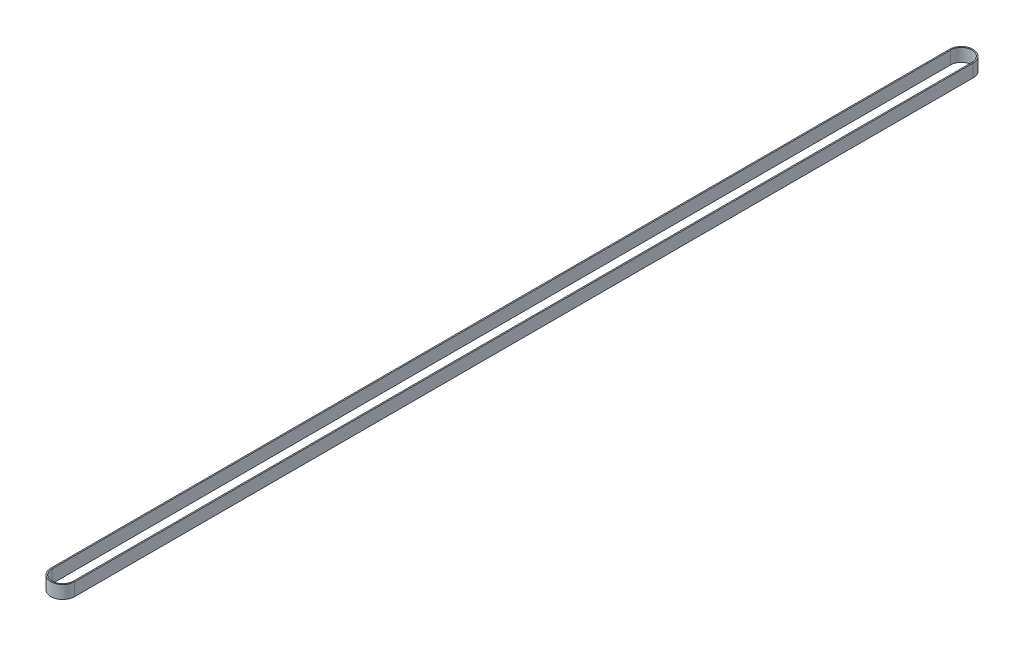
ISO-10303-21;
HEADER;
FILE_DESCRIPTION(('STEP AP214'),'2;1');
FILE_NAME('part.step','',(''),(''),'','','');
FILE_SCHEMA(('AUTOMOTIVE_DESIGN { 1 0 10303 214 1 1 1 1 }'));
ENDSEC;
DATA;
#1=APPLICATION_CONTEXT('core data for automotive mechanical design processes');
#2=APPLICATION_PROTOCOL_DEFINITION('international standard','automotive_design',2000,#1);
#3=PRODUCT_CONTEXT('',#1,'mechanical');
#4=PRODUCT('Part','Part','',(#3));
#5=PRODUCT_RELATED_PRODUCT_CATEGORY('part','',(#4));
#6=PRODUCT_DEFINITION_FORMATION('','',#4);
#7=PRODUCT_DEFINITION_CONTEXT('part definition',#1,'design');
#8=PRODUCT_DEFINITION('design','',#6,#7);
#9=PRODUCT_DEFINITION_SHAPE('','',#8);
#10=(LENGTH_UNIT() NAMED_UNIT(*) SI_UNIT(.MILLI.,.METRE.));
#11=(NAMED_UNIT(*) PLANE_ANGLE_UNIT() SI_UNIT($,.RADIAN.));
#12=(NAMED_UNIT(*) SI_UNIT($,.STERADIAN.) SOLID_ANGLE_UNIT());
#13=UNCERTAINTY_MEASURE_WITH_UNIT(LENGTH_MEASURE(1.E-05),#10,'distance_accuracy_value','');
#14=(GEOMETRIC_REPRESENTATION_CONTEXT(3) GLOBAL_UNCERTAINTY_ASSIGNED_CONTEXT((#13)) GLOBAL_UNIT_ASSIGNED_CONTEXT((#10,
#11,#12)) REPRESENTATION_CONTEXT('',''));
#15=CARTESIAN_POINT('',(0.,0.,0.));
#16=DIRECTION('',(0.,0.,1.));
#17=DIRECTION('',(1.,0.,0.));
#18=AXIS2_PLACEMENT_3D('',#15,#16,#17);
#19=CARTESIAN_POINT('',(-3.45527341487804E-12,11.,-400.));
#20=DIRECTION('',(0.,1.,0.));
#21=DIRECTION('',(0.,0.,1.));
#22=AXIS2_PLACEMENT_3D('',#19,#20,#21);
#23=PLANE('',#22);
#24=CARTESIAN_POINT('',(-3.45527341487804E-12,11.,-400.));
#25=DIRECTION('',(0.,1.,0.));
#26=DIRECTION('',(0.,0.,1.));
#27=AXIS2_PLACEMENT_3D('',#24,#25,#26);
#28=CIRCLE('',#27,10.05);
#29=CARTESIAN_POINT('',(10.0499999999966,11.,-400.));
#30=VERTEX_POINT('',#29);
#31=CARTESIAN_POINT('',(-10.0500000000034,11.,-400.));
#32=VERTEX_POINT('',#31);
#33=EDGE_CURVE('E153',#30,#32,#28,.T.);
#34=ORIENTED_EDGE('',*,*,#33,.T.);
#35=DIRECTION('',(0.,0.,1.));
#36=VECTOR('',#35,1.);
#37=CARTESIAN_POINT('',(-10.0500000000034,11.,-400.));
#38=LINE('',#37,#36);
#39=CARTESIAN_POINT('',(-10.0500000000034,11.,362.5));
#40=VERTEX_POINT('',#39);
#41=EDGE_CURVE('E157',#32,#40,#38,.T.);
#42=ORIENTED_EDGE('',*,*,#41,.T.);
#43=CARTESIAN_POINT('',(-3.38444550163075E-12,11.,362.5));
#44=DIRECTION('',(0.,1.,0.));
#45=DIRECTION('',(0.,0.,1.));
#46=AXIS2_PLACEMENT_3D('',#43,#44,#45);
#47=CIRCLE('',#46,10.05);
#48=CARTESIAN_POINT('',(10.0499999999966,11.,362.5));
#49=VERTEX_POINT('',#48);
#50=EDGE_CURVE('E161',#40,#49,#47,.T.);
#51=ORIENTED_EDGE('',*,*,#50,.T.);
#52=DIRECTION('',(0.,0.,-1.));
#53=VECTOR('',#52,1.);
#54=CARTESIAN_POINT('',(10.0499999999966,11.,362.5));
#55=LINE('',#54,#53);
#56=EDGE_CURVE('E164',#49,#30,#55,.T.);
#57=ORIENTED_EDGE('',*,*,#56,.T.);
#58=EDGE_LOOP('',(#34,#42,#51,#57));
#59=FACE_BOUND('',#58,.T.);
#60=DIRECTION('',(0.,0.,1.));
#61=VECTOR('',#60,1.);
#62=CARTESIAN_POINT('',(-9.05000000000344,11.,-400.));
#63=LINE('',#62,#61);
#64=CARTESIAN_POINT('',(-9.05000000000344,11.,-400.));
#65=VERTEX_POINT('',#64);
#66=CARTESIAN_POINT('',(-9.05000000000334,11.,362.5));
#67=VERTEX_POINT('',#66);
#68=EDGE_CURVE('E114',#65,#67,#63,.T.);
#69=ORIENTED_EDGE('',*,*,#68,.F.);
#70=CARTESIAN_POINT('',(-3.45527341487804E-12,11.,-400.));
#71=DIRECTION('',(0.,1.,0.));
#72=DIRECTION('',(0.,0.,1.));
#73=AXIS2_PLACEMENT_3D('',#70,#71,#72);
#74=CIRCLE('',#73,9.05000000000001);
#75=CARTESIAN_POINT('',(9.04999999999657,11.,-400.));
#76=VERTEX_POINT('',#75);
#77=EDGE_CURVE('E105',#76,#65,#74,.T.);
#78=ORIENTED_EDGE('',*,*,#77,.F.);
#79=DIRECTION('',(0.,0.,-1.));
#80=VECTOR('',#79,1.);
#81=CARTESIAN_POINT('',(9.04999999999657,11.,362.5));
#82=LINE('',#81,#80);
#83=CARTESIAN_POINT('',(9.04999999999657,11.,362.5));
#84=VERTEX_POINT('',#83);
#85=EDGE_CURVE('E131',#84,#76,#82,.T.);
#86=ORIENTED_EDGE('',*,*,#85,.F.);
#87=CARTESIAN_POINT('',(-3.38444550163075E-12,11.,362.5));
#88=DIRECTION('',(0.,1.,0.));
#89=DIRECTION('',(0.,0.,1.));
#90=AXIS2_PLACEMENT_3D('',#87,#88,#89);
#91=CIRCLE('',#90,9.04999999999996);
#92=EDGE_CURVE('E127',#67,#84,#91,.T.);
#93=ORIENTED_EDGE('',*,*,#92,.F.);
#94=EDGE_LOOP('',(#69,#78,#86,#93));
#95=FACE_BOUND('',#94,.T.);
#96=ADVANCED_FACE('F39',(#59,#95),#23,.T.);
#97=CARTESIAN_POINT('',(-3.45527341487804E-12,0.,-400.));
#98=DIRECTION('',(0.,1.,0.));
#99=DIRECTION('',(0.,0.,1.));
#100=AXIS2_PLACEMENT_3D('',#97,#98,#99);
#101=PLANE('',#100);
#102=CARTESIAN_POINT('',(-3.45527341487804E-12,0.,-400.));
#103=DIRECTION('',(0.,1.,0.));
#104=DIRECTION('',(0.,0.,1.));
#105=AXIS2_PLACEMENT_3D('',#102,#103,#104);
#106=CIRCLE('',#105,10.05);
#107=CARTESIAN_POINT('',(10.0499999999966,0.,-400.));
#108=VERTEX_POINT('',#107);
#109=CARTESIAN_POINT('',(-10.0500000000034,0.,-400.));
#110=VERTEX_POINT('',#109);
#111=EDGE_CURVE('E123',#108,#110,#106,.T.);
#112=ORIENTED_EDGE('',*,*,#111,.F.);
#113=DIRECTION('',(0.,0.,-1.));
#114=VECTOR('',#113,1.);
#115=CARTESIAN_POINT('',(10.0499999999966,0.,362.5));
#116=LINE('',#115,#114);
#117=CARTESIAN_POINT('',(10.0499999999966,0.,362.5));
#118=VERTEX_POINT('',#117);
#119=EDGE_CURVE('E158',#118,#108,#116,.T.);
#120=ORIENTED_EDGE('',*,*,#119,.F.);
#121=CARTESIAN_POINT('',(-3.38444550163075E-12,0.,362.5));
#122=DIRECTION('',(0.,1.,0.));
#123=DIRECTION('',(0.,0.,1.));
#124=AXIS2_PLACEMENT_3D('',#121,#122,#123);
#125=CIRCLE('',#124,10.05);
#126=CARTESIAN_POINT('',(-10.0500000000034,0.,362.5));
#127=VERTEX_POINT('',#126);
#128=EDGE_CURVE('E174',#127,#118,#125,.T.);
#129=ORIENTED_EDGE('',*,*,#128,.F.);
#130=DIRECTION('',(0.,0.,1.));
#131=VECTOR('',#130,1.);
#132=CARTESIAN_POINT('',(-10.0500000000034,0.,-400.));
#133=LINE('',#132,#131);
#134=EDGE_CURVE('E171',#110,#127,#133,.T.);
#135=ORIENTED_EDGE('',*,*,#134,.F.);
#136=EDGE_LOOP('',(#112,#120,#129,#135));
#137=FACE_BOUND('',#136,.T.);
#138=CARTESIAN_POINT('',(-3.45527341487804E-12,0.,-400.));
#139=DIRECTION('',(0.,1.,0.));
#140=DIRECTION('',(0.,0.,1.));
#141=AXIS2_PLACEMENT_3D('',#138,#139,#140);
#142=CIRCLE('',#141,9.05000000000001);
#143=CARTESIAN_POINT('',(9.04999999999657,0.,-400.));
#144=VERTEX_POINT('',#143);
#145=CARTESIAN_POINT('',(-9.05000000000344,0.,-400.));
#146=VERTEX_POINT('',#145);
#147=EDGE_CURVE('E63',#144,#146,#142,.T.);
#148=ORIENTED_EDGE('',*,*,#147,.T.);
#149=DIRECTION('',(0.,0.,1.));
#150=VECTOR('',#149,1.);
#151=CARTESIAN_POINT('',(-9.05000000000344,0.,-400.));
#152=LINE('',#151,#150);
#153=CARTESIAN_POINT('',(-9.05000000000334,0.,362.5));
#154=VERTEX_POINT('',#153);
#155=EDGE_CURVE('E121',#146,#154,#152,.T.);
#156=ORIENTED_EDGE('',*,*,#155,.T.);
#157=CARTESIAN_POINT('',(-3.38444550163075E-12,0.,362.5));
#158=DIRECTION('',(0.,1.,0.));
#159=DIRECTION('',(0.,0.,1.));
#160=AXIS2_PLACEMENT_3D('',#157,#158,#159);
#161=CIRCLE('',#160,9.04999999999996);
#162=CARTESIAN_POINT('',(9.04999999999657,0.,362.5));
#163=VERTEX_POINT('',#162);
#164=EDGE_CURVE('E140',#154,#163,#161,.T.);
#165=ORIENTED_EDGE('',*,*,#164,.T.);
#166=DIRECTION('',(0.,0.,-1.));
#167=VECTOR('',#166,1.);
#168=CARTESIAN_POINT('',(9.04999999999657,0.,362.5));
#169=LINE('',#168,#167);
#170=EDGE_CURVE('E115',#163,#144,#169,.T.);
#171=ORIENTED_EDGE('',*,*,#170,.T.);
#172=EDGE_LOOP('',(#148,#156,#165,#171));
#173=FACE_BOUND('',#172,.T.);
#174=ADVANCED_FACE('F197',(#137,#173),#101,.F.);
#175=CARTESIAN_POINT('',(-3.45527341487804E-12,11.,-400.));
#176=DIRECTION('',(0.,-1.,0.));
#177=DIRECTION('',(0.,0.,-1.));
#178=AXIS2_PLACEMENT_3D('',#175,#176,#177);
#179=CYLINDRICAL_SURFACE('',#178,10.05);
#180=ORIENTED_EDGE('',*,*,#111,.T.);
#181=DIRECTION('',(0.,-1.,0.));
#182=VECTOR('',#181,1.);
#183=CARTESIAN_POINT('',(-10.0500000000034,11.,-400.));
#184=LINE('',#183,#182);
#185=EDGE_CURVE('E11',#32,#110,#184,.T.);
#186=ORIENTED_EDGE('',*,*,#185,.F.);
#187=ORIENTED_EDGE('',*,*,#33,.F.);
#188=DIRECTION('',(0.,-1.,0.));
#189=VECTOR('',#188,1.);
#190=CARTESIAN_POINT('',(10.0499999999966,11.,-400.));
#191=LINE('',#190,#189);
#192=EDGE_CURVE('E167',#30,#108,#191,.T.);
#193=ORIENTED_EDGE('',*,*,#192,.T.);
#194=EDGE_LOOP('',(#180,#186,#187,#193));
#195=FACE_BOUND('',#194,.T.);
#196=ADVANCED_FACE('F41',(#195),#179,.T.);
#197=CARTESIAN_POINT('',(-10.0500000000034,11.,-400.));
#198=DIRECTION('',(1.,0.,0.));
#199=DIRECTION('',(0.,0.,-1.));
#200=AXIS2_PLACEMENT_3D('',#197,#198,#199);
#201=PLANE('',#200);
#202=ORIENTED_EDGE('',*,*,#134,.T.);
#203=DIRECTION('',(0.,-1.,0.));
#204=VECTOR('',#203,1.);
#205=CARTESIAN_POINT('',(-10.0500000000034,11.,362.5));
#206=LINE('',#205,#204);
#207=EDGE_CURVE('E48',#40,#127,#206,.T.);
#208=ORIENTED_EDGE('',*,*,#207,.F.);
#209=ORIENTED_EDGE('',*,*,#41,.F.);
#210=ORIENTED_EDGE('',*,*,#185,.T.);
#211=EDGE_LOOP('',(#202,#208,#209,#210));
#212=FACE_BOUND('',#211,.T.);
#213=ADVANCED_FACE('F207',(#212),#201,.F.);
#214=CARTESIAN_POINT('',(-3.38444550163075E-12,11.,362.5));
#215=DIRECTION('',(0.,-1.,0.));
#216=DIRECTION('',(0.,0.,-1.));
#217=AXIS2_PLACEMENT_3D('',#214,#215,#216);
#218=CYLINDRICAL_SURFACE('',#217,10.05);
#219=ORIENTED_EDGE('',*,*,#128,.T.);
#220=DIRECTION('',(0.,-1.,0.));
#221=VECTOR('',#220,1.);
#222=CARTESIAN_POINT('',(10.0499999999966,11.,362.5));
#223=LINE('',#222,#221);
#224=EDGE_CURVE('E182',#49,#118,#223,.T.);
#225=ORIENTED_EDGE('',*,*,#224,.F.);
#226=ORIENTED_EDGE('',*,*,#50,.F.);
#227=ORIENTED_EDGE('',*,*,#207,.T.);
#228=EDGE_LOOP('',(#219,#225,#226,#227));
#229=FACE_BOUND('',#228,.T.);
#230=ADVANCED_FACE('F191',(#229),#218,.T.);
#231=CARTESIAN_POINT('',(10.0499999999966,11.,362.5));
#232=DIRECTION('',(-1.,0.,0.));
#233=DIRECTION('',(0.,0.,1.));
#234=AXIS2_PLACEMENT_3D('',#231,#232,#233);
#235=PLANE('',#234);
#236=ORIENTED_EDGE('',*,*,#119,.T.);
#237=ORIENTED_EDGE('',*,*,#192,.F.);
#238=ORIENTED_EDGE('',*,*,#56,.F.);
#239=ORIENTED_EDGE('',*,*,#224,.T.);
#240=EDGE_LOOP('',(#236,#237,#238,#239));
#241=FACE_BOUND('',#240,.T.);
#242=ADVANCED_FACE('F201',(#241),#235,.F.);
#243=CARTESIAN_POINT('',(-3.45527341487804E-12,11.,-400.));
#244=DIRECTION('',(0.,-1.,0.));
#245=DIRECTION('',(0.,0.,-1.));
#246=AXIS2_PLACEMENT_3D('',#243,#244,#245);
#247=CYLINDRICAL_SURFACE('',#246,9.05000000000001);
#248=ORIENTED_EDGE('',*,*,#147,.F.);
#249=DIRECTION('',(0.,-1.,0.));
#250=VECTOR('',#249,1.);
#251=CARTESIAN_POINT('',(9.04999999999657,11.,-400.));
#252=LINE('',#251,#250);
#253=EDGE_CURVE('E109',#76,#144,#252,.T.);
#254=ORIENTED_EDGE('',*,*,#253,.F.);
#255=ORIENTED_EDGE('',*,*,#77,.T.);
#256=DIRECTION('',(0.,-1.,0.));
#257=VECTOR('',#256,1.);
#258=CARTESIAN_POINT('',(-9.05000000000344,11.,-400.));
#259=LINE('',#258,#257);
#260=EDGE_CURVE('E108',#65,#146,#259,.T.);
#261=ORIENTED_EDGE('',*,*,#260,.T.);
#262=EDGE_LOOP('',(#248,#254,#255,#261));
#263=FACE_BOUND('',#262,.T.);
#264=ADVANCED_FACE('F107',(#263),#247,.F.);
#265=CARTESIAN_POINT('',(-9.05000000000344,11.,-400.));
#266=DIRECTION('',(1.,0.,0.));
#267=DIRECTION('',(0.,0.,-1.));
#268=AXIS2_PLACEMENT_3D('',#265,#266,#267);
#269=PLANE('',#268);
#270=ORIENTED_EDGE('',*,*,#155,.F.);
#271=ORIENTED_EDGE('',*,*,#260,.F.);
#272=ORIENTED_EDGE('',*,*,#68,.T.);
#273=DIRECTION('',(0.,-1.,0.));
#274=VECTOR('',#273,1.);
#275=CARTESIAN_POINT('',(-9.05000000000334,11.,362.5));
#276=LINE('',#275,#274);
#277=EDGE_CURVE('E124',#67,#154,#276,.T.);
#278=ORIENTED_EDGE('',*,*,#277,.T.);
#279=EDGE_LOOP('',(#270,#271,#272,#278));
#280=FACE_BOUND('',#279,.T.);
#281=ADVANCED_FACE('F118',(#280),#269,.T.);
#282=CARTESIAN_POINT('',(-3.38444550163075E-12,11.,362.5));
#283=DIRECTION('',(0.,-1.,0.));
#284=DIRECTION('',(0.,0.,-1.));
#285=AXIS2_PLACEMENT_3D('',#282,#283,#284);
#286=CYLINDRICAL_SURFACE('',#285,9.04999999999996);
#287=ORIENTED_EDGE('',*,*,#164,.F.);
#288=ORIENTED_EDGE('',*,*,#277,.F.);
#289=ORIENTED_EDGE('',*,*,#92,.T.);
#290=DIRECTION('',(0.,-1.,0.));
#291=VECTOR('',#290,1.);
#292=CARTESIAN_POINT('',(9.04999999999657,11.,362.5));
#293=LINE('',#292,#291);
#294=EDGE_CURVE('E55',#84,#163,#293,.T.);
#295=ORIENTED_EDGE('',*,*,#294,.T.);
#296=EDGE_LOOP('',(#287,#288,#289,#295));
#297=FACE_BOUND('',#296,.T.);
#298=ADVANCED_FACE('F230',(#297),#286,.F.);
#299=CARTESIAN_POINT('',(9.04999999999657,11.,362.5));
#300=DIRECTION('',(-1.,0.,0.));
#301=DIRECTION('',(0.,0.,1.));
#302=AXIS2_PLACEMENT_3D('',#299,#300,#301);
#303=PLANE('',#302);
#304=ORIENTED_EDGE('',*,*,#170,.F.);
#305=ORIENTED_EDGE('',*,*,#294,.F.);
#306=ORIENTED_EDGE('',*,*,#85,.T.);
#307=ORIENTED_EDGE('',*,*,#253,.T.);
#308=EDGE_LOOP('',(#304,#305,#306,#307));
#309=FACE_BOUND('',#308,.T.);
#310=ADVANCED_FACE('F234',(#309),#303,.T.);
#311=CLOSED_SHELL('',(#96,#174,#196,#213,#230,#242,#264,#281,#298,#310));
#312=MANIFOLD_SOLID_BREP('B2',#311);
#313=ADVANCED_BREP_SHAPE_REPRESENTATION('',(#18,#312),#14);
#314=SHAPE_DEFINITION_REPRESENTATION(#9,#313);
ENDSEC;
END-ISO-10303-21;
